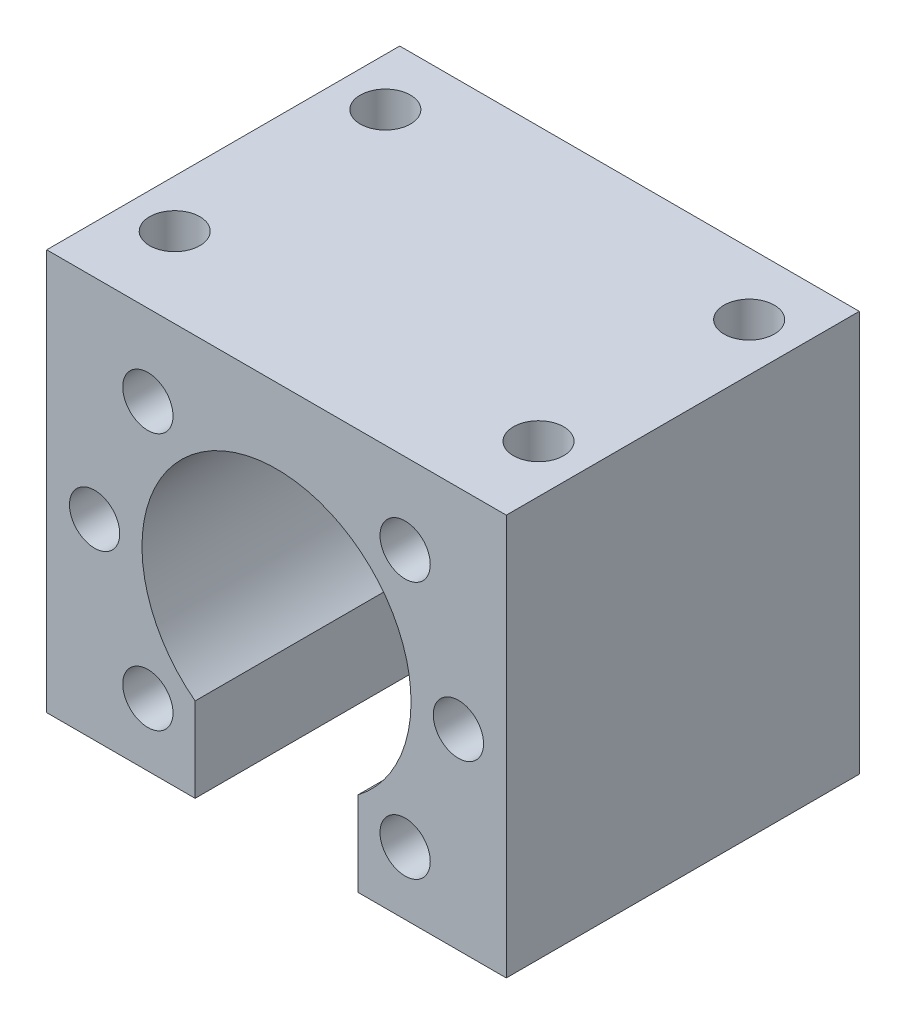
ISO-10303-21;
HEADER;
FILE_DESCRIPTION(('STEP AP214'),'2;1');
FILE_NAME('part.step','',(''),(''),'','','');
FILE_SCHEMA(('AUTOMOTIVE_DESIGN { 1 0 10303 214 1 1 1 1 }'));
ENDSEC;
DATA;
#1=APPLICATION_CONTEXT('core data for automotive mechanical design processes');
#2=APPLICATION_PROTOCOL_DEFINITION('international standard','automotive_design',2000,#1);
#3=PRODUCT_CONTEXT('',#1,'mechanical');
#4=PRODUCT('Part','Part','',(#3));
#5=PRODUCT_RELATED_PRODUCT_CATEGORY('part','',(#4));
#6=PRODUCT_DEFINITION_FORMATION('','',#4);
#7=PRODUCT_DEFINITION_CONTEXT('part definition',#1,'design');
#8=PRODUCT_DEFINITION('design','',#6,#7);
#9=PRODUCT_DEFINITION_SHAPE('','',#8);
#10=(LENGTH_UNIT() NAMED_UNIT(*) SI_UNIT(.MILLI.,.METRE.));
#11=(NAMED_UNIT(*) PLANE_ANGLE_UNIT() SI_UNIT($,.RADIAN.));
#12=(NAMED_UNIT(*) SI_UNIT($,.STERADIAN.) SOLID_ANGLE_UNIT());
#13=UNCERTAINTY_MEASURE_WITH_UNIT(LENGTH_MEASURE(1.E-05),#10,'distance_accuracy_value','');
#14=(GEOMETRIC_REPRESENTATION_CONTEXT(3) GLOBAL_UNCERTAINTY_ASSIGNED_CONTEXT((#13)) GLOBAL_UNIT_ASSIGNED_CONTEXT((#10,
#11,#12)) REPRESENTATION_CONTEXT('',''));
#15=CARTESIAN_POINT('',(0.,0.,0.));
#16=DIRECTION('',(0.,0.,1.));
#17=DIRECTION('',(1.,0.,0.));
#18=AXIS2_PLACEMENT_3D('',#15,#16,#17);
#19=CARTESIAN_POINT('',(-24.,-20.,36.8694999948));
#20=DIRECTION('',(1.,0.,0.));
#21=DIRECTION('',(0.,0.,-1.));
#22=AXIS2_PLACEMENT_3D('',#19,#20,#21);
#23=PLANE('',#22);
#24=DIRECTION('',(0.,-1.,0.));
#25=VECTOR('',#24,1.);
#26=CARTESIAN_POINT('',(-24.,-20.,0.));
#27=LINE('',#26,#25);
#28=CARTESIAN_POINT('',(-24.,21.8694999948,0.));
#29=VERTEX_POINT('',#28);
#30=CARTESIAN_POINT('',(-24.,-20.,0.));
#31=VERTEX_POINT('',#30);
#32=EDGE_CURVE('E125',#29,#31,#27,.T.);
#33=ORIENTED_EDGE('',*,*,#32,.T.);
#34=DIRECTION('',(0.,0.,-1.));
#35=VECTOR('',#34,1.);
#36=CARTESIAN_POINT('',(-24.,-20.,36.8694999948));
#37=LINE('',#36,#35);
#38=CARTESIAN_POINT('',(-24.,-20.,36.8694999948));
#39=VERTEX_POINT('',#38);
#40=EDGE_CURVE('E11',#39,#31,#37,.T.);
#41=ORIENTED_EDGE('',*,*,#40,.F.);
#42=DIRECTION('',(0.,-1.,0.));
#43=VECTOR('',#42,1.);
#44=CARTESIAN_POINT('',(-24.,-20.,36.8694999948));
#45=LINE('',#44,#43);
#46=CARTESIAN_POINT('',(-24.,21.8694999948,36.8694999948));
#47=VERTEX_POINT('',#46);
#48=EDGE_CURVE('E139',#47,#39,#45,.T.);
#49=ORIENTED_EDGE('',*,*,#48,.F.);
#50=DIRECTION('',(0.,0.,1.));
#51=VECTOR('',#50,1.);
#52=CARTESIAN_POINT('',(-24.,21.8694999948,0.));
#53=LINE('',#52,#51);
#54=EDGE_CURVE('E332',#29,#47,#53,.T.);
#55=ORIENTED_EDGE('',*,*,#54,.F.);
#56=EDGE_LOOP('',(#33,#41,#49,#55));
#57=FACE_BOUND('',#56,.T.);
#58=ADVANCED_FACE('F35',(#57),#23,.F.);
#59=CARTESIAN_POINT('',(-8.5,-20.,36.8694999948));
#60=DIRECTION('',(0.,1.,0.));
#61=DIRECTION('',(-1.,0.,0.));
#62=AXIS2_PLACEMENT_3D('',#59,#60,#61);
#63=PLANE('',#62);
#64=DIRECTION('',(1.,0.,0.));
#65=VECTOR('',#64,1.);
#66=CARTESIAN_POINT('',(-8.5,-20.,0.));
#67=LINE('',#66,#65);
#68=CARTESIAN_POINT('',(-8.5,-20.,0.));
#69=VERTEX_POINT('',#68);
#70=EDGE_CURVE('E128',#31,#69,#67,.T.);
#71=ORIENTED_EDGE('',*,*,#70,.T.);
#72=DIRECTION('',(0.,0.,-1.));
#73=VECTOR('',#72,1.);
#74=CARTESIAN_POINT('',(-8.5,-20.,36.8694999948));
#75=LINE('',#74,#73);
#76=CARTESIAN_POINT('',(-8.5,-20.,36.8694999948));
#77=VERTEX_POINT('',#76);
#78=EDGE_CURVE('E43',#77,#69,#75,.T.);
#79=ORIENTED_EDGE('',*,*,#78,.F.);
#80=DIRECTION('',(1.,0.,0.));
#81=VECTOR('',#80,1.);
#82=CARTESIAN_POINT('',(-8.5,-20.,36.8694999948));
#83=LINE('',#82,#81);
#84=EDGE_CURVE('E89',#39,#77,#83,.T.);
#85=ORIENTED_EDGE('',*,*,#84,.F.);
#86=ORIENTED_EDGE('',*,*,#40,.T.);
#87=EDGE_LOOP('',(#71,#79,#85,#86));
#88=FACE_BOUND('',#87,.T.);
#89=ADVANCED_FACE('F208',(#88),#63,.F.);
#90=CARTESIAN_POINT('',(-8.5,-11.187157815996,36.8694999948));
#91=DIRECTION('',(-1.,0.,0.));
#92=DIRECTION('',(0.,-1.,0.));
#93=AXIS2_PLACEMENT_3D('',#90,#91,#92);
#94=PLANE('',#93);
#95=DIRECTION('',(0.,1.,0.));
#96=VECTOR('',#95,1.);
#97=CARTESIAN_POINT('',(-8.5,-11.187157815996,0.));
#98=LINE('',#97,#96);
#99=CARTESIAN_POINT('',(-8.5,-11.187157815996,0.));
#100=VERTEX_POINT('',#99);
#101=EDGE_CURVE('E131',#69,#100,#98,.T.);
#102=ORIENTED_EDGE('',*,*,#101,.T.);
#103=DIRECTION('',(0.,0.,-1.));
#104=VECTOR('',#103,1.);
#105=CARTESIAN_POINT('',(-8.5,-11.187157815996,36.8694999948));
#106=LINE('',#105,#104);
#107=CARTESIAN_POINT('',(-8.5,-11.187157815996,36.8694999948));
#108=VERTEX_POINT('',#107);
#109=EDGE_CURVE('E114',#108,#100,#106,.T.);
#110=ORIENTED_EDGE('',*,*,#109,.F.);
#111=DIRECTION('',(0.,1.,0.));
#112=VECTOR('',#111,1.);
#113=CARTESIAN_POINT('',(-8.5,-11.187157815996,36.8694999948));
#114=LINE('',#113,#112);
#115=EDGE_CURVE('E105',#77,#108,#114,.T.);
#116=ORIENTED_EDGE('',*,*,#115,.F.);
#117=ORIENTED_EDGE('',*,*,#78,.T.);
#118=EDGE_LOOP('',(#102,#110,#116,#117));
#119=FACE_BOUND('',#118,.T.);
#120=ADVANCED_FACE('F145',(#119),#94,.F.);
#121=CARTESIAN_POINT('',(0.,0.,36.8694999948));
#122=DIRECTION('',(0.,0.,-1.));
#123=DIRECTION('',(-1.,0.,0.));
#124=AXIS2_PLACEMENT_3D('',#121,#122,#123);
#125=CYLINDRICAL_SURFACE('',#124,14.05);
#126=CARTESIAN_POINT('',(0.,0.,0.));
#127=DIRECTION('',(0.,0.,-1.));
#128=DIRECTION('',(1.,0.,0.));
#129=AXIS2_PLACEMENT_3D('',#126,#127,#128);
#130=CIRCLE('',#129,14.05);
#131=CARTESIAN_POINT('',(8.5,-11.187157815996,0.));
#132=VERTEX_POINT('',#131);
#133=EDGE_CURVE('E113',#100,#132,#130,.T.);
#134=ORIENTED_EDGE('',*,*,#133,.T.);
#135=DIRECTION('',(0.,0.,-1.));
#136=VECTOR('',#135,1.);
#137=CARTESIAN_POINT('',(8.5,-11.187157815996,36.8694999948));
#138=LINE('',#137,#136);
#139=CARTESIAN_POINT('',(8.5,-11.187157815996,36.8694999948));
#140=VERTEX_POINT('',#139);
#141=EDGE_CURVE('E110',#140,#132,#138,.T.);
#142=ORIENTED_EDGE('',*,*,#141,.F.);
#143=CARTESIAN_POINT('',(0.,0.,36.8694999948));
#144=DIRECTION('',(0.,0.,-1.));
#145=DIRECTION('',(1.,0.,0.));
#146=AXIS2_PLACEMENT_3D('',#143,#144,#145);
#147=CIRCLE('',#146,14.05);
#148=EDGE_CURVE('E99',#108,#140,#147,.T.);
#149=ORIENTED_EDGE('',*,*,#148,.F.);
#150=ORIENTED_EDGE('',*,*,#109,.T.);
#151=EDGE_LOOP('',(#134,#142,#149,#150));
#152=FACE_BOUND('',#151,.T.);
#153=ADVANCED_FACE('F111',(#152),#125,.F.);
#154=CARTESIAN_POINT('',(8.50000000000001,-20.,36.8694999948));
#155=DIRECTION('',(1.,0.,0.));
#156=DIRECTION('',(0.,1.,0.));
#157=AXIS2_PLACEMENT_3D('',#154,#155,#156);
#158=PLANE('',#157);
#159=DIRECTION('',(0.,-1.,0.));
#160=VECTOR('',#159,1.);
#161=CARTESIAN_POINT('',(8.50000000000001,-20.,0.));
#162=LINE('',#161,#160);
#163=CARTESIAN_POINT('',(8.50000000000001,-20.,0.));
#164=VERTEX_POINT('',#163);
#165=EDGE_CURVE('E75',#132,#164,#162,.T.);
#166=ORIENTED_EDGE('',*,*,#165,.T.);
#167=DIRECTION('',(0.,0.,-1.));
#168=VECTOR('',#167,1.);
#169=CARTESIAN_POINT('',(8.50000000000001,-20.,36.8694999948));
#170=LINE('',#169,#168);
#171=CARTESIAN_POINT('',(8.50000000000001,-20.,36.8694999948));
#172=VERTEX_POINT('',#171);
#173=EDGE_CURVE('E115',#172,#164,#170,.T.);
#174=ORIENTED_EDGE('',*,*,#173,.F.);
#175=DIRECTION('',(0.,-1.,0.));
#176=VECTOR('',#175,1.);
#177=CARTESIAN_POINT('',(8.50000000000001,-20.,36.8694999948));
#178=LINE('',#177,#176);
#179=EDGE_CURVE('E103',#140,#172,#178,.T.);
#180=ORIENTED_EDGE('',*,*,#179,.F.);
#181=ORIENTED_EDGE('',*,*,#141,.T.);
#182=EDGE_LOOP('',(#166,#174,#180,#181));
#183=FACE_BOUND('',#182,.T.);
#184=ADVANCED_FACE('F117',(#183),#158,.F.);
#185=CARTESIAN_POINT('',(24.,-20.,36.8694999948));
#186=DIRECTION('',(0.,1.,0.));
#187=DIRECTION('',(-1.,0.,0.));
#188=AXIS2_PLACEMENT_3D('',#185,#186,#187);
#189=PLANE('',#188);
#190=DIRECTION('',(1.,0.,0.));
#191=VECTOR('',#190,1.);
#192=CARTESIAN_POINT('',(24.,-20.,0.));
#193=LINE('',#192,#191);
#194=CARTESIAN_POINT('',(24.,-20.,0.));
#195=VERTEX_POINT('',#194);
#196=EDGE_CURVE('E81',#164,#195,#193,.T.);
#197=ORIENTED_EDGE('',*,*,#196,.T.);
#198=DIRECTION('',(0.,0.,-1.));
#199=VECTOR('',#198,1.);
#200=CARTESIAN_POINT('',(24.,-20.,36.8694999948));
#201=LINE('',#200,#199);
#202=CARTESIAN_POINT('',(24.,-20.,36.8694999948));
#203=VERTEX_POINT('',#202);
#204=EDGE_CURVE('E124',#203,#195,#201,.T.);
#205=ORIENTED_EDGE('',*,*,#204,.F.);
#206=DIRECTION('',(1.,0.,0.));
#207=VECTOR('',#206,1.);
#208=CARTESIAN_POINT('',(24.,-20.,36.8694999948));
#209=LINE('',#208,#207);
#210=EDGE_CURVE('E51',#172,#203,#209,.T.);
#211=ORIENTED_EDGE('',*,*,#210,.F.);
#212=ORIENTED_EDGE('',*,*,#173,.T.);
#213=EDGE_LOOP('',(#197,#205,#211,#212));
#214=FACE_BOUND('',#213,.T.);
#215=ADVANCED_FACE('F220',(#214),#189,.F.);
#216=CARTESIAN_POINT('',(24.,20.,36.8694999948));
#217=DIRECTION('',(-1.,0.,0.));
#218=DIRECTION('',(0.,-1.,0.));
#219=AXIS2_PLACEMENT_3D('',#216,#217,#218);
#220=PLANE('',#219);
#221=DIRECTION('',(0.,1.,0.));
#222=VECTOR('',#221,1.);
#223=CARTESIAN_POINT('',(24.,20.,0.));
#224=LINE('',#223,#222);
#225=CARTESIAN_POINT('',(24.,21.8694999948,0.));
#226=VERTEX_POINT('',#225);
#227=EDGE_CURVE('E136',#195,#226,#224,.T.);
#228=ORIENTED_EDGE('',*,*,#227,.T.);
#229=DIRECTION('',(0.,0.,-1.));
#230=VECTOR('',#229,1.);
#231=CARTESIAN_POINT('',(24.,21.8694999948,36.8694999948));
#232=LINE('',#231,#230);
#233=CARTESIAN_POINT('',(24.,21.8694999948,36.8694999948));
#234=VERTEX_POINT('',#233);
#235=EDGE_CURVE('E160',#234,#226,#232,.T.);
#236=ORIENTED_EDGE('',*,*,#235,.F.);
#237=DIRECTION('',(0.,1.,0.));
#238=VECTOR('',#237,1.);
#239=CARTESIAN_POINT('',(24.,20.,36.8694999948));
#240=LINE('',#239,#238);
#241=EDGE_CURVE('E119',#203,#234,#240,.T.);
#242=ORIENTED_EDGE('',*,*,#241,.F.);
#243=ORIENTED_EDGE('',*,*,#204,.T.);
#244=EDGE_LOOP('',(#228,#236,#242,#243));
#245=FACE_BOUND('',#244,.T.);
#246=ADVANCED_FACE('F157',(#245),#220,.F.);
#247=CARTESIAN_POINT('',(0.,0.,36.8694999948));
#248=DIRECTION('',(0.,0.,1.));
#249=DIRECTION('',(1.,0.,0.));
#250=AXIS2_PLACEMENT_3D('',#247,#248,#249);
#251=PLANE('',#250);
#252=CARTESIAN_POINT('',(-19.,0.,36.8694999948));
#253=DIRECTION('',(0.,0.,1.));
#254=DIRECTION('',(1.,0.,0.));
#255=AXIS2_PLACEMENT_3D('',#252,#253,#254);
#256=CIRCLE('',#255,2.625);
#257=CARTESIAN_POINT('',(-16.375,0.,36.8694999948));
#258=VERTEX_POINT('',#257);
#259=EDGE_CURVE('E347',#258,#258,#256,.T.);
#260=ORIENTED_EDGE('',*,*,#259,.F.);
#261=EDGE_LOOP('',(#260));
#262=FACE_BOUND('',#261,.T.);
#263=CARTESIAN_POINT('',(-13.4350288425444,-13.4350288425444,36.8694999948));
#264=DIRECTION('',(0.,0.,1.));
#265=DIRECTION('',(1.,0.,0.));
#266=AXIS2_PLACEMENT_3D('',#263,#264,#265);
#267=CIRCLE('',#266,2.625);
#268=CARTESIAN_POINT('',(-10.8100288425444,-13.4350288425444,36.8694999948));
#269=VERTEX_POINT('',#268);
#270=EDGE_CURVE('E353',#269,#269,#267,.T.);
#271=ORIENTED_EDGE('',*,*,#270,.F.);
#272=EDGE_LOOP('',(#271));
#273=FACE_BOUND('',#272,.T.);
#274=CARTESIAN_POINT('',(-13.4350288425444,13.4350288425444,36.8694999948));
#275=DIRECTION('',(0.,0.,1.));
#276=DIRECTION('',(1.,0.,0.));
#277=AXIS2_PLACEMENT_3D('',#274,#275,#276);
#278=CIRCLE('',#277,2.625);
#279=CARTESIAN_POINT('',(-10.8100288425444,13.4350288425444,36.8694999948));
#280=VERTEX_POINT('',#279);
#281=EDGE_CURVE('E359',#280,#280,#278,.T.);
#282=ORIENTED_EDGE('',*,*,#281,.F.);
#283=EDGE_LOOP('',(#282));
#284=FACE_BOUND('',#283,.T.);
#285=CARTESIAN_POINT('',(13.4350288425444,13.4350288425444,36.8694999948));
#286=DIRECTION('',(0.,0.,1.));
#287=DIRECTION('',(1.,0.,0.));
#288=AXIS2_PLACEMENT_3D('',#285,#286,#287);
#289=CIRCLE('',#288,2.625);
#290=CARTESIAN_POINT('',(16.0600288425444,13.4350288425444,36.8694999948));
#291=VERTEX_POINT('',#290);
#292=EDGE_CURVE('E365',#291,#291,#289,.T.);
#293=ORIENTED_EDGE('',*,*,#292,.F.);
#294=EDGE_LOOP('',(#293));
#295=FACE_BOUND('',#294,.T.);
#296=CARTESIAN_POINT('',(19.,0.,36.8694999948));
#297=DIRECTION('',(0.,0.,1.));
#298=DIRECTION('',(1.,0.,0.));
#299=AXIS2_PLACEMENT_3D('',#296,#297,#298);
#300=CIRCLE('',#299,2.625);
#301=CARTESIAN_POINT('',(21.625,0.,36.8694999948));
#302=VERTEX_POINT('',#301);
#303=EDGE_CURVE('E371',#302,#302,#300,.T.);
#304=ORIENTED_EDGE('',*,*,#303,.F.);
#305=EDGE_LOOP('',(#304));
#306=FACE_BOUND('',#305,.T.);
#307=CARTESIAN_POINT('',(13.4350288425444,-13.4350288425444,36.8694999948));
#308=DIRECTION('',(0.,0.,1.));
#309=DIRECTION('',(1.,0.,0.));
#310=AXIS2_PLACEMENT_3D('',#307,#308,#309);
#311=CIRCLE('',#310,2.625);
#312=CARTESIAN_POINT('',(16.0600288425444,-13.4350288425444,36.8694999948));
#313=VERTEX_POINT('',#312);
#314=EDGE_CURVE('E193',#313,#313,#311,.T.);
#315=ORIENTED_EDGE('',*,*,#314,.F.);
#316=EDGE_LOOP('',(#315));
#317=FACE_BOUND('',#316,.T.);
#318=ORIENTED_EDGE('',*,*,#48,.T.);
#319=ORIENTED_EDGE('',*,*,#84,.T.);
#320=ORIENTED_EDGE('',*,*,#115,.T.);
#321=ORIENTED_EDGE('',*,*,#148,.T.);
#322=ORIENTED_EDGE('',*,*,#179,.T.);
#323=ORIENTED_EDGE('',*,*,#210,.T.);
#324=ORIENTED_EDGE('',*,*,#241,.T.);
#325=DIRECTION('',(1.,0.,0.));
#326=VECTOR('',#325,1.);
#327=CARTESIAN_POINT('',(-24.,21.8694999948,36.8694999948));
#328=LINE('',#327,#326);
#329=EDGE_CURVE('E204',#47,#234,#328,.T.);
#330=ORIENTED_EDGE('',*,*,#329,.F.);
#331=EDGE_LOOP('',(#318,#319,#320,#321,#322,#323,#324,#330));
#332=FACE_BOUND('',#331,.T.);
#333=ADVANCED_FACE('F101',(#262,#273,#284,#295,#306,#317,#332),#251,.T.);
#334=CARTESIAN_POINT('',(0.,0.,0.));
#335=DIRECTION('',(0.,0.,1.));
#336=DIRECTION('',(1.,0.,0.));
#337=AXIS2_PLACEMENT_3D('',#334,#335,#336);
#338=PLANE('',#337);
#339=ORIENTED_EDGE('',*,*,#32,.F.);
#340=DIRECTION('',(-1.,0.,0.));
#341=VECTOR('',#340,1.);
#342=CARTESIAN_POINT('',(24.,21.8694999948,0.));
#343=LINE('',#342,#341);
#344=EDGE_CURVE('E153',#226,#29,#343,.T.);
#345=ORIENTED_EDGE('',*,*,#344,.F.);
#346=ORIENTED_EDGE('',*,*,#227,.F.);
#347=ORIENTED_EDGE('',*,*,#196,.F.);
#348=ORIENTED_EDGE('',*,*,#165,.F.);
#349=ORIENTED_EDGE('',*,*,#133,.F.);
#350=ORIENTED_EDGE('',*,*,#101,.F.);
#351=ORIENTED_EDGE('',*,*,#70,.F.);
#352=EDGE_LOOP('',(#339,#345,#346,#347,#348,#349,#350,#351));
#353=FACE_BOUND('',#352,.T.);
#354=ADVANCED_FACE('F148',(#353),#338,.F.);
#355=CARTESIAN_POINT('',(13.4350288425444,-13.4350288425444,16.8694999948));
#356=DIRECTION('',(0.,0.,1.));
#357=DIRECTION('',(1.,0.,0.));
#358=AXIS2_PLACEMENT_3D('',#355,#356,#357);
#359=CONICAL_SURFACE('',#358,2.625,1.02974425867666);
#360=CARTESIAN_POINT('',(13.4350288425444,-13.4350288425444,15.2922408698527));
#361=VERTEX_POINT('',#360);
#362=VERTEX_LOOP('',#361);
#363=FACE_BOUND('',#362,.T.);
#364=CARTESIAN_POINT('',(13.4350288425444,-13.4350288425444,16.8694999948));
#365=DIRECTION('',(0.,0.,1.));
#366=DIRECTION('',(1.,0.,0.));
#367=AXIS2_PLACEMENT_3D('',#364,#365,#366);
#368=CIRCLE('',#367,2.625);
#369=CARTESIAN_POINT('',(16.0600288425444,-13.4350288425444,16.8694999948));
#370=VERTEX_POINT('',#369);
#371=EDGE_CURVE('E129',#370,#370,#368,.T.);
#372=ORIENTED_EDGE('',*,*,#371,.T.);
#373=EDGE_LOOP('',(#372));
#374=FACE_BOUND('',#373,.T.);
#375=ADVANCED_FACE('F185',(#363,#374),#359,.F.);
#376=CARTESIAN_POINT('',(13.4350288425444,-13.4350288425444,36.8694999948));
#377=DIRECTION('',(0.,0.,1.));
#378=DIRECTION('',(1.,0.,0.));
#379=AXIS2_PLACEMENT_3D('',#376,#377,#378);
#380=CYLINDRICAL_SURFACE('',#379,2.625);
#381=ORIENTED_EDGE('',*,*,#371,.F.);
#382=EDGE_LOOP('',(#381));
#383=FACE_BOUND('',#382,.T.);
#384=ORIENTED_EDGE('',*,*,#314,.T.);
#385=EDGE_LOOP('',(#384));
#386=FACE_BOUND('',#385,.T.);
#387=ADVANCED_FACE('F188',(#383,#386),#380,.F.);
#388=CARTESIAN_POINT('',(19.,0.,16.8694999948));
#389=DIRECTION('',(0.,0.,1.));
#390=DIRECTION('',(1.,0.,0.));
#391=AXIS2_PLACEMENT_3D('',#388,#389,#390);
#392=CONICAL_SURFACE('',#391,2.625,1.02974425867666);
#393=CARTESIAN_POINT('',(19.,0.,15.2922408698527));
#394=VERTEX_POINT('',#393);
#395=VERTEX_LOOP('',#394);
#396=FACE_BOUND('',#395,.T.);
#397=CARTESIAN_POINT('',(19.,0.,16.8694999948));
#398=DIRECTION('',(0.,0.,1.));
#399=DIRECTION('',(1.,0.,0.));
#400=AXIS2_PLACEMENT_3D('',#397,#398,#399);
#401=CIRCLE('',#400,2.625);
#402=CARTESIAN_POINT('',(21.625,0.,16.8694999948));
#403=VERTEX_POINT('',#402);
#404=EDGE_CURVE('E196',#403,#403,#401,.T.);
#405=ORIENTED_EDGE('',*,*,#404,.T.);
#406=EDGE_LOOP('',(#405));
#407=FACE_BOUND('',#406,.T.);
#408=ADVANCED_FACE('F232',(#396,#407),#392,.F.);
#409=CARTESIAN_POINT('',(19.,0.,36.8694999948));
#410=DIRECTION('',(0.,0.,1.));
#411=DIRECTION('',(1.,0.,0.));
#412=AXIS2_PLACEMENT_3D('',#409,#410,#411);
#413=CYLINDRICAL_SURFACE('',#412,2.625);
#414=ORIENTED_EDGE('',*,*,#404,.F.);
#415=EDGE_LOOP('',(#414));
#416=FACE_BOUND('',#415,.T.);
#417=ORIENTED_EDGE('',*,*,#303,.T.);
#418=EDGE_LOOP('',(#417));
#419=FACE_BOUND('',#418,.T.);
#420=ADVANCED_FACE('F235',(#416,#419),#413,.F.);
#421=CARTESIAN_POINT('',(13.4350288425444,13.4350288425444,16.8694999948));
#422=DIRECTION('',(0.,0.,1.));
#423=DIRECTION('',(1.,0.,0.));
#424=AXIS2_PLACEMENT_3D('',#421,#422,#423);
#425=CONICAL_SURFACE('',#424,2.625,1.02974425867666);
#426=CARTESIAN_POINT('',(13.4350288425444,13.4350288425444,15.2922408698527));
#427=VERTEX_POINT('',#426);
#428=VERTEX_LOOP('',#427);
#429=FACE_BOUND('',#428,.T.);
#430=CARTESIAN_POINT('',(13.4350288425444,13.4350288425444,16.8694999948));
#431=DIRECTION('',(0.,0.,1.));
#432=DIRECTION('',(1.,0.,0.));
#433=AXIS2_PLACEMENT_3D('',#430,#431,#432);
#434=CIRCLE('',#433,2.625);
#435=CARTESIAN_POINT('',(16.0600288425444,13.4350288425444,16.8694999948));
#436=VERTEX_POINT('',#435);
#437=EDGE_CURVE('E368',#436,#436,#434,.T.);
#438=ORIENTED_EDGE('',*,*,#437,.T.);
#439=EDGE_LOOP('',(#438));
#440=FACE_BOUND('',#439,.T.);
#441=ADVANCED_FACE('F238',(#429,#440),#425,.F.);
#442=CARTESIAN_POINT('',(13.4350288425444,13.4350288425444,36.8694999948));
#443=DIRECTION('',(0.,0.,1.));
#444=DIRECTION('',(1.,0.,0.));
#445=AXIS2_PLACEMENT_3D('',#442,#443,#444);
#446=CYLINDRICAL_SURFACE('',#445,2.625);
#447=ORIENTED_EDGE('',*,*,#437,.F.);
#448=EDGE_LOOP('',(#447));
#449=FACE_BOUND('',#448,.T.);
#450=ORIENTED_EDGE('',*,*,#292,.T.);
#451=EDGE_LOOP('',(#450));
#452=FACE_BOUND('',#451,.T.);
#453=ADVANCED_FACE('F242',(#449,#452),#446,.F.);
#454=CARTESIAN_POINT('',(-13.4350288425444,13.4350288425444,16.8694999948));
#455=DIRECTION('',(0.,0.,1.));
#456=DIRECTION('',(1.,0.,0.));
#457=AXIS2_PLACEMENT_3D('',#454,#455,#456);
#458=CONICAL_SURFACE('',#457,2.625,1.02974425867666);
#459=CARTESIAN_POINT('',(-13.4350288425444,13.4350288425444,15.2922408698527));
#460=VERTEX_POINT('',#459);
#461=VERTEX_LOOP('',#460);
#462=FACE_BOUND('',#461,.T.);
#463=CARTESIAN_POINT('',(-13.4350288425444,13.4350288425444,16.8694999948));
#464=DIRECTION('',(0.,0.,1.));
#465=DIRECTION('',(1.,0.,0.));
#466=AXIS2_PLACEMENT_3D('',#463,#464,#465);
#467=CIRCLE('',#466,2.625);
#468=CARTESIAN_POINT('',(-10.8100288425444,13.4350288425444,16.8694999948));
#469=VERTEX_POINT('',#468);
#470=EDGE_CURVE('E362',#469,#469,#467,.T.);
#471=ORIENTED_EDGE('',*,*,#470,.T.);
#472=EDGE_LOOP('',(#471));
#473=FACE_BOUND('',#472,.T.);
#474=ADVANCED_FACE('F246',(#462,#473),#458,.F.);
#475=CARTESIAN_POINT('',(-13.4350288425444,13.4350288425444,36.8694999948));
#476=DIRECTION('',(0.,0.,1.));
#477=DIRECTION('',(1.,0.,0.));
#478=AXIS2_PLACEMENT_3D('',#475,#476,#477);
#479=CYLINDRICAL_SURFACE('',#478,2.625);
#480=ORIENTED_EDGE('',*,*,#470,.F.);
#481=EDGE_LOOP('',(#480));
#482=FACE_BOUND('',#481,.T.);
#483=ORIENTED_EDGE('',*,*,#281,.T.);
#484=EDGE_LOOP('',(#483));
#485=FACE_BOUND('',#484,.T.);
#486=ADVANCED_FACE('F250',(#482,#485),#479,.F.);
#487=CARTESIAN_POINT('',(-13.4350288425444,-13.4350288425444,16.8694999948));
#488=DIRECTION('',(0.,0.,1.));
#489=DIRECTION('',(1.,0.,0.));
#490=AXIS2_PLACEMENT_3D('',#487,#488,#489);
#491=CONICAL_SURFACE('',#490,2.625,1.02974425867666);
#492=CARTESIAN_POINT('',(-13.4350288425444,-13.4350288425444,15.2922408698527));
#493=VERTEX_POINT('',#492);
#494=VERTEX_LOOP('',#493);
#495=FACE_BOUND('',#494,.T.);
#496=CARTESIAN_POINT('',(-13.4350288425444,-13.4350288425444,16.8694999948));
#497=DIRECTION('',(0.,0.,1.));
#498=DIRECTION('',(1.,0.,0.));
#499=AXIS2_PLACEMENT_3D('',#496,#497,#498);
#500=CIRCLE('',#499,2.625);
#501=CARTESIAN_POINT('',(-10.8100288425444,-13.4350288425444,16.8694999948));
#502=VERTEX_POINT('',#501);
#503=EDGE_CURVE('E356',#502,#502,#500,.T.);
#504=ORIENTED_EDGE('',*,*,#503,.T.);
#505=EDGE_LOOP('',(#504));
#506=FACE_BOUND('',#505,.T.);
#507=ADVANCED_FACE('F254',(#495,#506),#491,.F.);
#508=CARTESIAN_POINT('',(-13.4350288425444,-13.4350288425444,36.8694999948));
#509=DIRECTION('',(0.,0.,1.));
#510=DIRECTION('',(1.,0.,0.));
#511=AXIS2_PLACEMENT_3D('',#508,#509,#510);
#512=CYLINDRICAL_SURFACE('',#511,2.625);
#513=ORIENTED_EDGE('',*,*,#503,.F.);
#514=EDGE_LOOP('',(#513));
#515=FACE_BOUND('',#514,.T.);
#516=ORIENTED_EDGE('',*,*,#270,.T.);
#517=EDGE_LOOP('',(#516));
#518=FACE_BOUND('',#517,.T.);
#519=ADVANCED_FACE('F258',(#515,#518),#512,.F.);
#520=CARTESIAN_POINT('',(-19.,0.,16.8694999948));
#521=DIRECTION('',(0.,0.,1.));
#522=DIRECTION('',(1.,0.,0.));
#523=AXIS2_PLACEMENT_3D('',#520,#521,#522);
#524=CONICAL_SURFACE('',#523,2.625,1.02974425867666);
#525=CARTESIAN_POINT('',(-19.,0.,15.2922408698527));
#526=VERTEX_POINT('',#525);
#527=VERTEX_LOOP('',#526);
#528=FACE_BOUND('',#527,.T.);
#529=CARTESIAN_POINT('',(-19.,0.,16.8694999948));
#530=DIRECTION('',(0.,0.,1.));
#531=DIRECTION('',(1.,0.,0.));
#532=AXIS2_PLACEMENT_3D('',#529,#530,#531);
#533=CIRCLE('',#532,2.625);
#534=CARTESIAN_POINT('',(-16.375,0.,16.8694999948));
#535=VERTEX_POINT('',#534);
#536=EDGE_CURVE('E350',#535,#535,#533,.T.);
#537=ORIENTED_EDGE('',*,*,#536,.T.);
#538=EDGE_LOOP('',(#537));
#539=FACE_BOUND('',#538,.T.);
#540=ADVANCED_FACE('F262',(#528,#539),#524,.F.);
#541=CARTESIAN_POINT('',(-19.,0.,36.8694999948));
#542=DIRECTION('',(0.,0.,1.));
#543=DIRECTION('',(1.,0.,0.));
#544=AXIS2_PLACEMENT_3D('',#541,#542,#543);
#545=CYLINDRICAL_SURFACE('',#544,2.625);
#546=ORIENTED_EDGE('',*,*,#536,.F.);
#547=EDGE_LOOP('',(#546));
#548=FACE_BOUND('',#547,.T.);
#549=ORIENTED_EDGE('',*,*,#259,.T.);
#550=EDGE_LOOP('',(#549));
#551=FACE_BOUND('',#550,.T.);
#552=ADVANCED_FACE('F266',(#548,#551),#545,.F.);
#553=CARTESIAN_POINT('',(0.,21.8694999948,0.));
#554=DIRECTION('',(0.,1.,0.));
#555=DIRECTION('',(0.,0.,1.));
#556=AXIS2_PLACEMENT_3D('',#553,#554,#555);
#557=PLANE('',#556);
#558=CARTESIAN_POINT('',(19.,21.8694999948,6.5));
#559=DIRECTION('',(0.,1.,0.));
#560=DIRECTION('',(0.,0.,1.));
#561=AXIS2_PLACEMENT_3D('',#558,#559,#560);
#562=CIRCLE('',#561,2.625);
#563=CARTESIAN_POINT('',(19.,21.8694999948,9.125));
#564=VERTEX_POINT('',#563);
#565=EDGE_CURVE('E311',#564,#564,#562,.T.);
#566=ORIENTED_EDGE('',*,*,#565,.F.);
#567=EDGE_LOOP('',(#566));
#568=FACE_BOUND('',#567,.T.);
#569=CARTESIAN_POINT('',(-19.,21.8694999948,28.5));
#570=DIRECTION('',(0.,1.,0.));
#571=DIRECTION('',(0.,0.,1.));
#572=AXIS2_PLACEMENT_3D('',#569,#570,#571);
#573=CIRCLE('',#572,2.625);
#574=CARTESIAN_POINT('',(-19.,21.8694999948,31.125));
#575=VERTEX_POINT('',#574);
#576=EDGE_CURVE('E315',#575,#575,#573,.T.);
#577=ORIENTED_EDGE('',*,*,#576,.F.);
#578=EDGE_LOOP('',(#577));
#579=FACE_BOUND('',#578,.T.);
#580=ORIENTED_EDGE('',*,*,#235,.T.);
#581=ORIENTED_EDGE('',*,*,#344,.T.);
#582=ORIENTED_EDGE('',*,*,#54,.T.);
#583=ORIENTED_EDGE('',*,*,#329,.T.);
#584=EDGE_LOOP('',(#580,#581,#582,#583));
#585=FACE_BOUND('',#584,.T.);
#586=CARTESIAN_POINT('',(-19.,21.8694999948,6.5));
#587=DIRECTION('',(0.,1.,0.));
#588=DIRECTION('',(0.,0.,1.));
#589=AXIS2_PLACEMENT_3D('',#586,#587,#588);
#590=CIRCLE('',#589,2.625);
#591=CARTESIAN_POINT('',(-19.,21.8694999948,9.125));
#592=VERTEX_POINT('',#591);
#593=EDGE_CURVE('E320',#592,#592,#590,.T.);
#594=ORIENTED_EDGE('',*,*,#593,.F.);
#595=EDGE_LOOP('',(#594));
#596=FACE_BOUND('',#595,.T.);
#597=CARTESIAN_POINT('',(19.,21.8694999948,28.5));
#598=DIRECTION('',(0.,1.,0.));
#599=DIRECTION('',(0.,0.,1.));
#600=AXIS2_PLACEMENT_3D('',#597,#598,#599);
#601=CIRCLE('',#600,2.625);
#602=CARTESIAN_POINT('',(19.,21.8694999948,31.125));
#603=VERTEX_POINT('',#602);
#604=EDGE_CURVE('E323',#603,#603,#601,.T.);
#605=ORIENTED_EDGE('',*,*,#604,.F.);
#606=EDGE_LOOP('',(#605));
#607=FACE_BOUND('',#606,.T.);
#608=ADVANCED_FACE('F270',(#568,#579,#585,#596,#607),#557,.T.);
#609=CARTESIAN_POINT('',(19.,3.,28.5));
#610=DIRECTION('',(0.,-1.,0.));
#611=DIRECTION('',(0.,0.,-1.));
#612=AXIS2_PLACEMENT_3D('',#609,#610,#611);
#613=PLANE('',#612);
#614=CARTESIAN_POINT('',(19.,3.,28.5));
#615=DIRECTION('',(0.,1.,0.));
#616=DIRECTION('',(0.,0.,1.));
#617=AXIS2_PLACEMENT_3D('',#614,#615,#616);
#618=CIRCLE('',#617,2.62500000000001);
#619=CARTESIAN_POINT('',(19.,3.,31.125));
#620=VERTEX_POINT('',#619);
#621=EDGE_CURVE('E344',#620,#620,#618,.T.);
#622=ORIENTED_EDGE('',*,*,#621,.T.);
#623=EDGE_LOOP('',(#622));
#624=FACE_BOUND('',#623,.T.);
#625=ADVANCED_FACE('F272',(#624),#613,.F.);
#626=CARTESIAN_POINT('',(19.,20.,28.5));
#627=DIRECTION('',(0.,1.,0.));
#628=DIRECTION('',(0.,0.,1.));
#629=AXIS2_PLACEMENT_3D('',#626,#627,#628);
#630=CYLINDRICAL_SURFACE('',#629,2.62500000000001);
#631=ORIENTED_EDGE('',*,*,#621,.F.);
#632=EDGE_LOOP('',(#631));
#633=FACE_BOUND('',#632,.T.);
#634=ORIENTED_EDGE('',*,*,#604,.T.);
#635=EDGE_LOOP('',(#634));
#636=FACE_BOUND('',#635,.T.);
#637=ADVANCED_FACE('F275',(#633,#636),#630,.F.);
#638=CARTESIAN_POINT('',(-19.,3.,28.5));
#639=DIRECTION('',(0.,-1.,0.));
#640=DIRECTION('',(0.,0.,-1.));
#641=AXIS2_PLACEMENT_3D('',#638,#639,#640);
#642=PLANE('',#641);
#643=CARTESIAN_POINT('',(-19.,3.,28.5));
#644=DIRECTION('',(0.,1.,0.));
#645=DIRECTION('',(0.,0.,1.));
#646=AXIS2_PLACEMENT_3D('',#643,#644,#645);
#647=CIRCLE('',#646,2.62500000000001);
#648=CARTESIAN_POINT('',(-19.,3.,31.125));
#649=VERTEX_POINT('',#648);
#650=EDGE_CURVE('E341',#649,#649,#647,.T.);
#651=ORIENTED_EDGE('',*,*,#650,.T.);
#652=EDGE_LOOP('',(#651));
#653=FACE_BOUND('',#652,.T.);
#654=ADVANCED_FACE('F279',(#653),#642,.F.);
#655=CARTESIAN_POINT('',(-19.,20.,28.5));
#656=DIRECTION('',(0.,1.,0.));
#657=DIRECTION('',(0.,0.,1.));
#658=AXIS2_PLACEMENT_3D('',#655,#656,#657);
#659=CYLINDRICAL_SURFACE('',#658,2.62500000000001);
#660=ORIENTED_EDGE('',*,*,#650,.F.);
#661=EDGE_LOOP('',(#660));
#662=FACE_BOUND('',#661,.T.);
#663=ORIENTED_EDGE('',*,*,#576,.T.);
#664=EDGE_LOOP('',(#663));
#665=FACE_BOUND('',#664,.T.);
#666=ADVANCED_FACE('F283',(#662,#665),#659,.F.);
#667=CARTESIAN_POINT('',(19.,3.,6.5));
#668=DIRECTION('',(0.,-1.,0.));
#669=DIRECTION('',(0.,0.,-1.));
#670=AXIS2_PLACEMENT_3D('',#667,#668,#669);
#671=PLANE('',#670);
#672=CARTESIAN_POINT('',(19.,3.,6.5));
#673=DIRECTION('',(0.,1.,0.));
#674=DIRECTION('',(0.,0.,1.));
#675=AXIS2_PLACEMENT_3D('',#672,#673,#674);
#676=CIRCLE('',#675,2.62500000000001);
#677=CARTESIAN_POINT('',(19.,3.,9.12500000000001));
#678=VERTEX_POINT('',#677);
#679=EDGE_CURVE('E338',#678,#678,#676,.T.);
#680=ORIENTED_EDGE('',*,*,#679,.T.);
#681=EDGE_LOOP('',(#680));
#682=FACE_BOUND('',#681,.T.);
#683=ADVANCED_FACE('F287',(#682),#671,.F.);
#684=CARTESIAN_POINT('',(19.,20.,6.5));
#685=DIRECTION('',(0.,1.,0.));
#686=DIRECTION('',(0.,0.,1.));
#687=AXIS2_PLACEMENT_3D('',#684,#685,#686);
#688=CYLINDRICAL_SURFACE('',#687,2.62500000000001);
#689=ORIENTED_EDGE('',*,*,#679,.F.);
#690=EDGE_LOOP('',(#689));
#691=FACE_BOUND('',#690,.T.);
#692=ORIENTED_EDGE('',*,*,#565,.T.);
#693=EDGE_LOOP('',(#692));
#694=FACE_BOUND('',#693,.T.);
#695=ADVANCED_FACE('F291',(#691,#694),#688,.F.);
#696=CARTESIAN_POINT('',(-19.,3.,6.5));
#697=DIRECTION('',(0.,-1.,0.));
#698=DIRECTION('',(0.,0.,-1.));
#699=AXIS2_PLACEMENT_3D('',#696,#697,#698);
#700=PLANE('',#699);
#701=CARTESIAN_POINT('',(-19.,3.,6.5));
#702=DIRECTION('',(0.,1.,0.));
#703=DIRECTION('',(0.,0.,1.));
#704=AXIS2_PLACEMENT_3D('',#701,#702,#703);
#705=CIRCLE('',#704,2.62500000000001);
#706=CARTESIAN_POINT('',(-19.,3.,9.12500000000001));
#707=VERTEX_POINT('',#706);
#708=EDGE_CURVE('E335',#707,#707,#705,.T.);
#709=ORIENTED_EDGE('',*,*,#708,.T.);
#710=EDGE_LOOP('',(#709));
#711=FACE_BOUND('',#710,.T.);
#712=ADVANCED_FACE('F295',(#711),#700,.F.);
#713=CARTESIAN_POINT('',(-19.,20.,6.5));
#714=DIRECTION('',(0.,1.,0.));
#715=DIRECTION('',(0.,0.,1.));
#716=AXIS2_PLACEMENT_3D('',#713,#714,#715);
#717=CYLINDRICAL_SURFACE('',#716,2.62500000000001);
#718=ORIENTED_EDGE('',*,*,#708,.F.);
#719=EDGE_LOOP('',(#718));
#720=FACE_BOUND('',#719,.T.);
#721=ORIENTED_EDGE('',*,*,#593,.T.);
#722=EDGE_LOOP('',(#721));
#723=FACE_BOUND('',#722,.T.);
#724=ADVANCED_FACE('F299',(#720,#723),#717,.F.);
#725=CLOSED_SHELL('',(#58,#89,#120,#153,#184,#215,#246,#333,#354,#375,#387,#408,#420,#441,#453,
#474,#486,#507,#519,#540,#552,#608,#625,#637,#654,#666,#683,#695,#712,#724));
#726=MANIFOLD_SOLID_BREP('B2',#725);
#727=ADVANCED_BREP_SHAPE_REPRESENTATION('',(#18,#726),#14);
#728=SHAPE_DEFINITION_REPRESENTATION(#9,#727);
ENDSEC;
END-ISO-10303-21;
